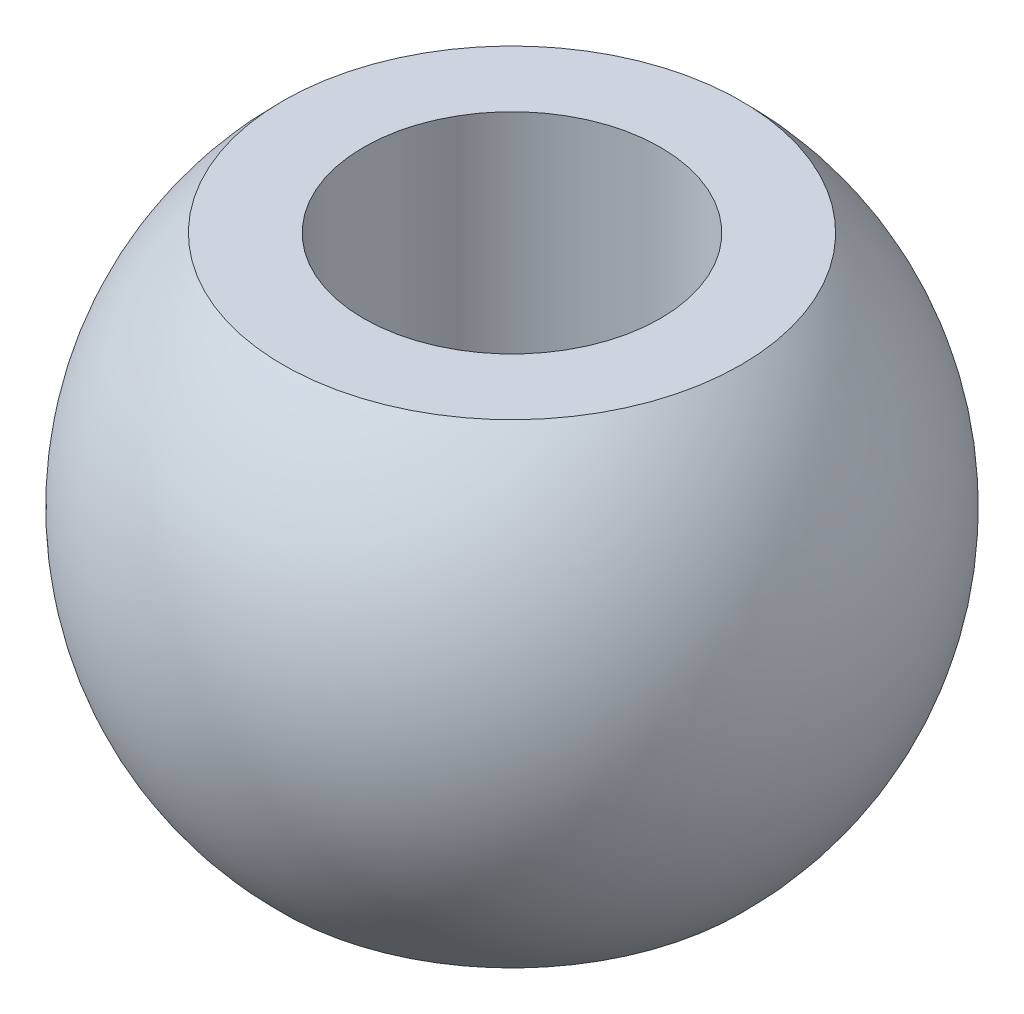
ISO-10303-21;
HEADER;
FILE_DESCRIPTION(('STEP AP214'),'2;1');
FILE_NAME('part.step','',(''),(''),'','','');
FILE_SCHEMA(('AUTOMOTIVE_DESIGN { 1 0 10303 214 1 1 1 1 }'));
ENDSEC;
DATA;
#1=APPLICATION_CONTEXT('core data for automotive mechanical design processes');
#2=APPLICATION_PROTOCOL_DEFINITION('international standard','automotive_design',2000,#1);
#3=PRODUCT_CONTEXT('',#1,'mechanical');
#4=PRODUCT('Part','Part','',(#3));
#5=PRODUCT_RELATED_PRODUCT_CATEGORY('part','',(#4));
#6=PRODUCT_DEFINITION_FORMATION('','',#4);
#7=PRODUCT_DEFINITION_CONTEXT('part definition',#1,'design');
#8=PRODUCT_DEFINITION('design','',#6,#7);
#9=PRODUCT_DEFINITION_SHAPE('','',#8);
#10=(LENGTH_UNIT() NAMED_UNIT(*) SI_UNIT(.MILLI.,.METRE.));
#11=(NAMED_UNIT(*) PLANE_ANGLE_UNIT() SI_UNIT($,.RADIAN.));
#12=(NAMED_UNIT(*) SI_UNIT($,.STERADIAN.) SOLID_ANGLE_UNIT());
#13=UNCERTAINTY_MEASURE_WITH_UNIT(LENGTH_MEASURE(1.E-05),#10,'distance_accuracy_value','');
#14=(GEOMETRIC_REPRESENTATION_CONTEXT(3) GLOBAL_UNCERTAINTY_ASSIGNED_CONTEXT((#13)) GLOBAL_UNIT_ASSIGNED_CONTEXT((#10,
#11,#12)) REPRESENTATION_CONTEXT('',''));
#15=CARTESIAN_POINT('',(0.,0.,0.));
#16=DIRECTION('',(0.,0.,1.));
#17=DIRECTION('',(1.,0.,0.));
#18=AXIS2_PLACEMENT_3D('',#15,#16,#17);
#19=CARTESIAN_POINT('',(2.5,4.,0.));
#20=DIRECTION('',(0.,-1.,0.));
#21=DIRECTION('',(0.,0.,-1.));
#22=AXIS2_PLACEMENT_3D('',#19,#20,#21);
#23=PLANE('',#22);
#24=CARTESIAN_POINT('',(0.,4.,0.));
#25=DIRECTION('',(0.,1.,0.));
#26=DIRECTION('',(0.,0.,1.));
#27=AXIS2_PLACEMENT_3D('',#24,#25,#26);
#28=CIRCLE('',#27,2.5);
#29=CARTESIAN_POINT('',(0.,4.,2.5));
#30=VERTEX_POINT('',#29);
#31=EDGE_CURVE('E10',#30,#30,#28,.T.);
#32=ORIENTED_EDGE('',*,*,#31,.F.);
#33=EDGE_LOOP('',(#32));
#34=FACE_BOUND('',#33,.T.);
#35=CARTESIAN_POINT('',(0.,4.,0.));
#36=DIRECTION('',(0.,1.,0.));
#37=DIRECTION('',(0.,0.,1.));
#38=AXIS2_PLACEMENT_3D('',#35,#36,#37);
#39=CIRCLE('',#38,3.85605186687109);
#40=CARTESIAN_POINT('',(3.85605186687109,4.,0.));
#41=VERTEX_POINT('',#40);
#42=EDGE_CURVE('E60',#41,#41,#39,.T.);
#43=ORIENTED_EDGE('',*,*,#42,.T.);
#44=EDGE_LOOP('',(#43));
#45=FACE_BOUND('',#44,.T.);
#46=ADVANCED_FACE('F43',(#34,#45),#23,.F.);
#47=CARTESIAN_POINT('',(0.,6.85001979593708,0.));
#48=DIRECTION('',(0.,1.,0.));
#49=DIRECTION('',(0.,0.,1.));
#50=AXIS2_PLACEMENT_3D('',#47,#48,#49);
#51=CYLINDRICAL_SURFACE('',#50,2.5);
#52=CARTESIAN_POINT('',(0.,-4.,0.));
#53=DIRECTION('',(0.,1.,0.));
#54=DIRECTION('',(0.,0.,1.));
#55=AXIS2_PLACEMENT_3D('',#52,#53,#54);
#56=CIRCLE('',#55,2.5);
#57=CARTESIAN_POINT('',(0.,-4.,2.5));
#58=VERTEX_POINT('',#57);
#59=EDGE_CURVE('E50',#58,#58,#56,.T.);
#60=ORIENTED_EDGE('',*,*,#59,.F.);
#61=EDGE_LOOP('',(#60));
#62=FACE_BOUND('',#61,.T.);
#63=ORIENTED_EDGE('',*,*,#31,.T.);
#64=EDGE_LOOP('',(#63));
#65=FACE_BOUND('',#64,.T.);
#66=ADVANCED_FACE('F76',(#62,#65),#51,.F.);
#67=CARTESIAN_POINT('',(2.5,-4.,0.));
#68=DIRECTION('',(0.,1.,0.));
#69=DIRECTION('',(0.,0.,1.));
#70=AXIS2_PLACEMENT_3D('',#67,#68,#69);
#71=PLANE('',#70);
#72=CARTESIAN_POINT('',(0.,-4.,0.));
#73=DIRECTION('',(0.,1.,0.));
#74=DIRECTION('',(0.,0.,1.));
#75=AXIS2_PLACEMENT_3D('',#72,#73,#74);
#76=CIRCLE('',#75,3.85605186687109);
#77=CARTESIAN_POINT('',(3.85605186687109,-4.,0.));
#78=VERTEX_POINT('',#77);
#79=EDGE_CURVE('E55',#78,#78,#76,.T.);
#80=ORIENTED_EDGE('',*,*,#79,.F.);
#81=EDGE_LOOP('',(#80));
#82=FACE_BOUND('',#81,.T.);
#83=ORIENTED_EDGE('',*,*,#59,.T.);
#84=EDGE_LOOP('',(#83));
#85=FACE_BOUND('',#84,.T.);
#86=ADVANCED_FACE('F71',(#82,#85),#71,.F.);
#87=CARTESIAN_POINT('',(0.,0.,0.));
#88=DIRECTION('',(0.,1.,0.));
#89=DIRECTION('',(1.,0.,0.));
#90=AXIS2_PLACEMENT_3D('',#87,#88,#89);
#91=SPHERICAL_SURFACE('',#90,5.556);
#92=CARTESIAN_POINT('',(3.85605186687109,4.,0.));
#93=CARTESIAN_POINT('',(3.9230300194151,3.93543512969419,0.));
#94=CARTESIAN_POINT('',(3.98838349384291,3.86918519663236,0.));
#95=CARTESIAN_POINT('',(4.11568299434118,3.73348869845822,0.));
#96=CARTESIAN_POINT('',(4.17762902041163,3.66404213334591,0.));
#97=CARTESIAN_POINT('',(4.29795553207025,3.52212586453241,0.));
#98=CARTESIAN_POINT('',(4.35633601765841,3.44965616083121,0.));
#99=CARTESIAN_POINT('',(4.46938465461005,3.30187689582289,0.));
#100=CARTESIAN_POINT('',(4.52405280597352,3.22656733451577,0.));
#101=CARTESIAN_POINT('',(4.62953872891637,3.07329822058874,0.));
#102=CARTESIAN_POINT('',(4.68035650049574,2.99533866796885,0.));
#103=CARTESIAN_POINT('',(4.77801349730373,2.83696627816753,0.));
#104=CARTESIAN_POINT('',(4.82485272253235,2.75655344098611,0.));
#105=CARTESIAN_POINT('',(4.91443445271524,2.59347733631396,0.));
#106=CARTESIAN_POINT('',(4.95717695766951,2.51081406882323,0.));
#107=CARTESIAN_POINT('',(5.03845742033352,2.34344564623982,0.));
#108=CARTESIAN_POINT('',(5.07699537804325,2.25874049114714,0.));
#109=CARTESIAN_POINT('',(5.14976952316924,2.08750198429396,0.));
#110=CARTESIAN_POINT('',(5.1840057105855,2.00096863253347,0.));
#111=CARTESIAN_POINT('',(5.24808994530212,1.82629203619693,0.));
#112=CARTESIAN_POINT('',(5.27793799260249,1.73814879162089,0.));
#113=CARTESIAN_POINT('',(5.33317064730165,1.56047477467942,0.));
#114=CARTESIAN_POINT('',(5.35855525470045,1.470944002314,0.));
#115=CARTESIAN_POINT('',(5.40479699010115,1.29072079528987,0.));
#116=CARTESIAN_POINT('',(5.42565411810307,1.20002836063116,0.));
#117=CARTESIAN_POINT('',(5.46278827698433,1.01771062510712,0.));
#118=CARTESIAN_POINT('',(5.47906530786368,0.926085324241792,0.));
#119=CARTESIAN_POINT('',(5.50699820930695,0.742133005801553,0.));
#120=CARTESIAN_POINT('',(5.51865407987086,0.64980598822664,0.));
#121=CARTESIAN_POINT('',(5.53731525561057,0.464683156132521,0.));
#122=CARTESIAN_POINT('',(5.54432056078637,0.371887341613315,0.));
#123=CARTESIAN_POINT('',(5.55366293298108,0.186061018062738,0.));
#124=CARTESIAN_POINT('',(5.556,0.0930305090313676,0.));
#125=CARTESIAN_POINT('',(5.556,-0.0930305090313738,0.));
#126=CARTESIAN_POINT('',(5.55366293298108,-0.186061018062744,0.));
#127=CARTESIAN_POINT('',(5.54432056078637,-0.371887341613321,0.));
#128=CARTESIAN_POINT('',(5.53731525561057,-0.464683156132527,0.));
#129=CARTESIAN_POINT('',(5.51865407987086,-0.649805988226646,0.));
#130=CARTESIAN_POINT('',(5.50699820930694,-0.742133005801559,0.));
#131=CARTESIAN_POINT('',(5.47906530786368,-0.926085324241798,0.));
#132=CARTESIAN_POINT('',(5.46278827698433,-1.01771062510712,0.));
#133=CARTESIAN_POINT('',(5.42565411810307,-1.20002836063116,0.));
#134=CARTESIAN_POINT('',(5.40479699010115,-1.29072079528987,0.));
#135=CARTESIAN_POINT('',(5.35855525470044,-1.47094400231401,0.));
#136=CARTESIAN_POINT('',(5.33317064730165,-1.56047477467943,0.));
#137=CARTESIAN_POINT('',(5.27793799260249,-1.73814879162089,0.));
#138=CARTESIAN_POINT('',(5.24808994530212,-1.82629203619694,0.));
#139=CARTESIAN_POINT('',(5.1840057105855,-2.00096863253347,0.));
#140=CARTESIAN_POINT('',(5.14976952316924,-2.08750198429397,0.));
#141=CARTESIAN_POINT('',(5.07699537804325,-2.25874049114715,0.));
#142=CARTESIAN_POINT('',(5.03845742033352,-2.34344564623982,0.));
#143=CARTESIAN_POINT('',(4.95717695766951,-2.51081406882323,0.));
#144=CARTESIAN_POINT('',(4.91443445271524,-2.59347733631396,0.));
#145=CARTESIAN_POINT('',(4.82485272253234,-2.75655344098612,0.));
#146=CARTESIAN_POINT('',(4.77801349730372,-2.83696627816754,0.));
#147=CARTESIAN_POINT('',(4.68035650049574,-2.99533866796886,0.));
#148=CARTESIAN_POINT('',(4.62953872891636,-3.07329822058875,0.));
#149=CARTESIAN_POINT('',(4.52405280597352,-3.22656733451577,0.));
#150=CARTESIAN_POINT('',(4.46938465461004,-3.3018768958229,0.));
#151=CARTESIAN_POINT('',(4.35633601765841,-3.44965616083122,0.));
#152=CARTESIAN_POINT('',(4.29795553207025,-3.52212586453241,0.));
#153=CARTESIAN_POINT('',(4.17762902041163,-3.66404213334591,0.));
#154=CARTESIAN_POINT('',(4.11568299434117,-3.73348869845822,0.));
#155=CARTESIAN_POINT('',(3.98838349384291,-3.86918519663236,0.));
#156=CARTESIAN_POINT('',(3.9230300194151,-3.9354351296942,0.));
#157=CARTESIAN_POINT('',(3.85605186687109,-4.,0.));
#158=B_SPLINE_CURVE_WITH_KNOTS('',3,(#92,#93,#94,#95,#96,#97,#98,#99,#100,#101,#102,#103,#104,
#105,#106,#107,#108,#109,#110,#111,#112,#113,#114,#115,#116,#117,#118,#119,#120,#121,#122,#123,
#124,#125,#126,#127,#128,#129,#130,#131,#132,#133,#134,#135,#136,#137,#138,#139,#140,#141,#142,
#143,#144,#145,#146,#147,#148,#149,#150,#151,#152,#153,#154,#155,#156,#157),.UNSPECIFIED.,.F.,
.F.,(4,2,2,2,2,2,2,2,2,2,2,2,2,2,2,2,2,2,2,2,2,2,2,2,2,2,2,2,2,2,2,2,4),(0.,0.2790621949101,
0.558124389820202,0.837186584730303,1.1162487796404,1.3953109745505,1.6743731694606,
1.95343536437071,2.23249755928081,2.51155975419091,2.79062194910101,3.06968414401111,
3.34874633892121,3.62780853383131,3.90687072874141,4.18593292365151,4.46499511856161,
4.74405731347171,5.02311950838182,5.30218170329192,5.58124389820202,5.86030609311212,
6.13936828802222,6.41843048293232,6.69749267784242,6.97655487275252,7.25561706766262,
7.53467926257272,7.81374145748283,8.09280365239293,8.37186584730303,8.65092804221313,
8.92999023712323),.UNSPECIFIED.);
#159=EDGE_CURVE('BSEAM68',#41,#78,#158,.T.);
#160=ORIENTED_EDGE('',*,*,#42,.F.);
#161=ORIENTED_EDGE('',*,*,#79,.T.);
#162=ORIENTED_EDGE('',*,*,#159,.T.);
#163=ORIENTED_EDGE('',*,*,#159,.F.);
#164=EDGE_LOOP('',(#160,#162,#161,#163));
#165=FACE_BOUND('',#164,.T.);
#166=ADVANCED_FACE('F68',(#165),#91,.T.);
#167=CLOSED_SHELL('',(#46,#66,#86,#166));
#168=MANIFOLD_SOLID_BREP('B2',#167);
#169=ADVANCED_BREP_SHAPE_REPRESENTATION('',(#18,#168),#14);
#170=SHAPE_DEFINITION_REPRESENTATION(#9,#169);
ENDSEC;
END-ISO-10303-21;
